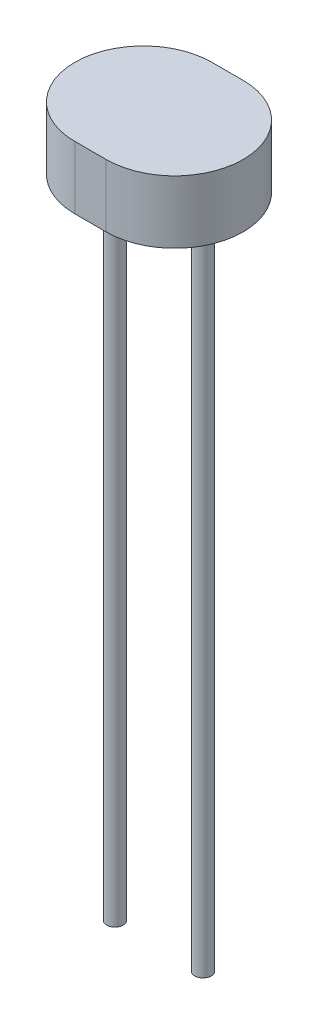
ISO-10303-21;
HEADER;
FILE_DESCRIPTION(('STEP AP214'),'2;1');
FILE_NAME('part.step','',(''),(''),'','','');
FILE_SCHEMA(('AUTOMOTIVE_DESIGN { 1 0 10303 214 1 1 1 1 }'));
ENDSEC;
DATA;
#1=APPLICATION_CONTEXT('core data for automotive mechanical design processes');
#2=APPLICATION_PROTOCOL_DEFINITION('international standard','automotive_design',2000,#1);
#3=PRODUCT_CONTEXT('',#1,'mechanical');
#4=PRODUCT('Part','Part','',(#3));
#5=PRODUCT_RELATED_PRODUCT_CATEGORY('part','',(#4));
#6=PRODUCT_DEFINITION_FORMATION('','',#4);
#7=PRODUCT_DEFINITION_CONTEXT('part definition',#1,'design');
#8=PRODUCT_DEFINITION('design','',#6,#7);
#9=PRODUCT_DEFINITION_SHAPE('','',#8);
#10=(LENGTH_UNIT() NAMED_UNIT(*) SI_UNIT(.MILLI.,.METRE.));
#11=(NAMED_UNIT(*) PLANE_ANGLE_UNIT() SI_UNIT($,.RADIAN.));
#12=(NAMED_UNIT(*) SI_UNIT($,.STERADIAN.) SOLID_ANGLE_UNIT());
#13=UNCERTAINTY_MEASURE_WITH_UNIT(LENGTH_MEASURE(1.E-05),#10,'distance_accuracy_value','');
#14=(GEOMETRIC_REPRESENTATION_CONTEXT(3) GLOBAL_UNCERTAINTY_ASSIGNED_CONTEXT((#13)) GLOBAL_UNIT_ASSIGNED_CONTEXT((#10,
#11,#12)) REPRESENTATION_CONTEXT('',''));
#15=CARTESIAN_POINT('',(0.,0.,0.));
#16=DIRECTION('',(0.,0.,1.));
#17=DIRECTION('',(1.,0.,0.));
#18=AXIS2_PLACEMENT_3D('',#15,#16,#17);
#19=CARTESIAN_POINT('',(-0.475,1.9,0.));
#20=DIRECTION('',(0.,-1.,0.));
#21=DIRECTION('',(0.,0.,-1.));
#22=AXIS2_PLACEMENT_3D('',#19,#20,#21);
#23=CYLINDRICAL_SURFACE('',#22,2.075);
#24=CARTESIAN_POINT('',(-0.475,0.,0.));
#25=DIRECTION('',(0.,1.,0.));
#26=DIRECTION('',(0.,0.,1.));
#27=AXIS2_PLACEMENT_3D('',#24,#25,#26);
#28=CIRCLE('',#27,2.075);
#29=CARTESIAN_POINT('',(-0.475,0.,-2.075));
#30=VERTEX_POINT('',#29);
#31=CARTESIAN_POINT('',(-0.475,0.,2.075));
#32=VERTEX_POINT('',#31);
#33=EDGE_CURVE('E100',#30,#32,#28,.T.);
#34=ORIENTED_EDGE('',*,*,#33,.T.);
#35=DIRECTION('',(0.,-1.,0.));
#36=VECTOR('',#35,1.);
#37=CARTESIAN_POINT('',(-0.475,1.9,2.075));
#38=LINE('',#37,#36);
#39=CARTESIAN_POINT('',(-0.475,1.9,2.075));
#40=VERTEX_POINT('',#39);
#41=EDGE_CURVE('E91',#40,#32,#38,.T.);
#42=ORIENTED_EDGE('',*,*,#41,.F.);
#43=CARTESIAN_POINT('',(-0.475,1.9,0.));
#44=DIRECTION('',(0.,1.,0.));
#45=DIRECTION('',(0.,0.,1.));
#46=AXIS2_PLACEMENT_3D('',#43,#44,#45);
#47=CIRCLE('',#46,2.075);
#48=CARTESIAN_POINT('',(-0.475,1.9,-2.075));
#49=VERTEX_POINT('',#48);
#50=EDGE_CURVE('E85',#49,#40,#47,.T.);
#51=ORIENTED_EDGE('',*,*,#50,.F.);
#52=DIRECTION('',(0.,-1.,0.));
#53=VECTOR('',#52,1.);
#54=CARTESIAN_POINT('',(-0.475,1.9,-2.075));
#55=LINE('',#54,#53);
#56=EDGE_CURVE('E96',#49,#30,#55,.T.);
#57=ORIENTED_EDGE('',*,*,#56,.T.);
#58=EDGE_LOOP('',(#34,#42,#51,#57));
#59=FACE_BOUND('',#58,.T.);
#60=ADVANCED_FACE('F33',(#59),#23,.T.);
#61=CARTESIAN_POINT('',(-0.475,1.9,2.075));
#62=DIRECTION('',(0.,0.,-1.));
#63=DIRECTION('',(-1.,0.,0.));
#64=AXIS2_PLACEMENT_3D('',#61,#62,#63);
#65=PLANE('',#64);
#66=DIRECTION('',(1.,0.,0.));
#67=VECTOR('',#66,1.);
#68=CARTESIAN_POINT('',(-0.475,0.,2.075));
#69=LINE('',#68,#67);
#70=CARTESIAN_POINT('',(0.475000000000001,0.,2.075));
#71=VERTEX_POINT('',#70);
#72=EDGE_CURVE('E90',#32,#71,#69,.T.);
#73=ORIENTED_EDGE('',*,*,#72,.T.);
#74=DIRECTION('',(0.,-1.,0.));
#75=VECTOR('',#74,1.);
#76=CARTESIAN_POINT('',(0.475000000000001,1.9,2.075));
#77=LINE('',#76,#75);
#78=CARTESIAN_POINT('',(0.475000000000001,1.9,2.075));
#79=VERTEX_POINT('',#78);
#80=EDGE_CURVE('E88',#79,#71,#77,.T.);
#81=ORIENTED_EDGE('',*,*,#80,.F.);
#82=DIRECTION('',(1.,0.,0.));
#83=VECTOR('',#82,1.);
#84=CARTESIAN_POINT('',(-0.475,1.9,2.075));
#85=LINE('',#84,#83);
#86=EDGE_CURVE('E80',#40,#79,#85,.T.);
#87=ORIENTED_EDGE('',*,*,#86,.F.);
#88=ORIENTED_EDGE('',*,*,#41,.T.);
#89=EDGE_LOOP('',(#73,#81,#87,#88));
#90=FACE_BOUND('',#89,.T.);
#91=ADVANCED_FACE('F89',(#90),#65,.F.);
#92=CARTESIAN_POINT('',(0.475,1.9,0.));
#93=DIRECTION('',(0.,-1.,0.));
#94=DIRECTION('',(0.,0.,-1.));
#95=AXIS2_PLACEMENT_3D('',#92,#93,#94);
#96=CYLINDRICAL_SURFACE('',#95,2.075);
#97=CARTESIAN_POINT('',(0.475,0.,0.));
#98=DIRECTION('',(0.,1.,0.));
#99=DIRECTION('',(0.,0.,1.));
#100=AXIS2_PLACEMENT_3D('',#97,#98,#99);
#101=CIRCLE('',#100,2.075);
#102=CARTESIAN_POINT('',(0.474999999999999,0.,-2.075));
#103=VERTEX_POINT('',#102);
#104=EDGE_CURVE('E66',#71,#103,#101,.T.);
#105=ORIENTED_EDGE('',*,*,#104,.T.);
#106=DIRECTION('',(0.,-1.,0.));
#107=VECTOR('',#106,1.);
#108=CARTESIAN_POINT('',(0.474999999999999,1.9,-2.075));
#109=LINE('',#108,#107);
#110=CARTESIAN_POINT('',(0.474999999999999,1.9,-2.075));
#111=VERTEX_POINT('',#110);
#112=EDGE_CURVE('E92',#111,#103,#109,.T.);
#113=ORIENTED_EDGE('',*,*,#112,.F.);
#114=CARTESIAN_POINT('',(0.475,1.9,0.));
#115=DIRECTION('',(0.,1.,0.));
#116=DIRECTION('',(0.,0.,1.));
#117=AXIS2_PLACEMENT_3D('',#114,#115,#116);
#118=CIRCLE('',#117,2.075);
#119=EDGE_CURVE('E83',#79,#111,#118,.T.);
#120=ORIENTED_EDGE('',*,*,#119,.F.);
#121=ORIENTED_EDGE('',*,*,#80,.T.);
#122=EDGE_LOOP('',(#105,#113,#120,#121));
#123=FACE_BOUND('',#122,.T.);
#124=ADVANCED_FACE('F94',(#123),#96,.T.);
#125=CARTESIAN_POINT('',(-0.475,1.9,-2.075));
#126=DIRECTION('',(0.,0.,1.));
#127=DIRECTION('',(1.,0.,0.));
#128=AXIS2_PLACEMENT_3D('',#125,#126,#127);
#129=PLANE('',#128);
#130=DIRECTION('',(-1.,0.,0.));
#131=VECTOR('',#130,1.);
#132=CARTESIAN_POINT('',(-0.475,0.,-2.075));
#133=LINE('',#132,#131);
#134=EDGE_CURVE('E72',#103,#30,#133,.T.);
#135=ORIENTED_EDGE('',*,*,#134,.T.);
#136=ORIENTED_EDGE('',*,*,#56,.F.);
#137=DIRECTION('',(-1.,0.,0.));
#138=VECTOR('',#137,1.);
#139=CARTESIAN_POINT('',(-0.475,1.9,-2.075));
#140=LINE('',#139,#138);
#141=EDGE_CURVE('E49',#111,#49,#140,.T.);
#142=ORIENTED_EDGE('',*,*,#141,.F.);
#143=ORIENTED_EDGE('',*,*,#112,.T.);
#144=EDGE_LOOP('',(#135,#136,#142,#143));
#145=FACE_BOUND('',#144,.T.);
#146=ADVANCED_FACE('F121',(#145),#129,.F.);
#147=CARTESIAN_POINT('',(-0.475,1.9,0.));
#148=DIRECTION('',(0.,1.,0.));
#149=DIRECTION('',(0.,0.,1.));
#150=AXIS2_PLACEMENT_3D('',#147,#148,#149);
#151=PLANE('',#150);
#152=ORIENTED_EDGE('',*,*,#50,.T.);
#153=ORIENTED_EDGE('',*,*,#86,.T.);
#154=ORIENTED_EDGE('',*,*,#119,.T.);
#155=ORIENTED_EDGE('',*,*,#141,.T.);
#156=EDGE_LOOP('',(#152,#153,#154,#155));
#157=FACE_BOUND('',#156,.T.);
#158=ADVANCED_FACE('F81',(#157),#151,.T.);
#159=CARTESIAN_POINT('',(-0.475,0.,0.));
#160=DIRECTION('',(0.,1.,0.));
#161=DIRECTION('',(0.,0.,1.));
#162=AXIS2_PLACEMENT_3D('',#159,#160,#161);
#163=PLANE('',#162);
#164=CARTESIAN_POINT('',(1.33371264397152,0.,0.));
#165=DIRECTION('',(0.,1.,0.));
#166=DIRECTION('',(0.,0.,1.));
#167=AXIS2_PLACEMENT_3D('',#164,#165,#166);
#168=CIRCLE('',#167,0.25);
#169=CARTESIAN_POINT('',(1.33371264397152,0.,0.25));
#170=VERTEX_POINT('',#169);
#171=EDGE_CURVE('E11',#170,#170,#168,.F.);
#172=ORIENTED_EDGE('',*,*,#171,.F.);
#173=EDGE_LOOP('',(#172));
#174=FACE_BOUND('',#173,.T.);
#175=CARTESIAN_POINT('',(-1.33371264397152,0.,0.));
#176=DIRECTION('',(0.,1.,0.));
#177=DIRECTION('',(0.,0.,1.));
#178=AXIS2_PLACEMENT_3D('',#175,#176,#177);
#179=CIRCLE('',#178,0.25);
#180=CARTESIAN_POINT('',(-1.33371264397152,0.,0.25));
#181=VERTEX_POINT('',#180);
#182=EDGE_CURVE('E41',#181,#181,#179,.F.);
#183=ORIENTED_EDGE('',*,*,#182,.F.);
#184=EDGE_LOOP('',(#183));
#185=FACE_BOUND('',#184,.T.);
#186=ORIENTED_EDGE('',*,*,#33,.F.);
#187=ORIENTED_EDGE('',*,*,#134,.F.);
#188=ORIENTED_EDGE('',*,*,#104,.F.);
#189=ORIENTED_EDGE('',*,*,#72,.F.);
#190=EDGE_LOOP('',(#186,#187,#188,#189));
#191=FACE_BOUND('',#190,.T.);
#192=ADVANCED_FACE('F114',(#174,#185,#191),#163,.F.);
#193=CARTESIAN_POINT('',(-1.33371264397152,-20.,0.));
#194=DIRECTION('',(0.,1.,0.));
#195=DIRECTION('',(0.,0.,1.));
#196=AXIS2_PLACEMENT_3D('',#193,#194,#195);
#197=CYLINDRICAL_SURFACE('',#196,0.25);
#198=CARTESIAN_POINT('',(-1.33371264397152,-20.,0.));
#199=DIRECTION('',(0.,-1.,0.));
#200=DIRECTION('',(0.,0.,-1.));
#201=AXIS2_PLACEMENT_3D('',#198,#199,#200);
#202=CIRCLE('',#201,0.25);
#203=CARTESIAN_POINT('',(-1.33371264397152,-20.,-0.25));
#204=VERTEX_POINT('',#203);
#205=EDGE_CURVE('E103',#204,#204,#202,.T.);
#206=ORIENTED_EDGE('',*,*,#205,.F.);
#207=EDGE_LOOP('',(#206));
#208=FACE_BOUND('',#207,.T.);
#209=ORIENTED_EDGE('',*,*,#182,.T.);
#210=EDGE_LOOP('',(#209));
#211=FACE_BOUND('',#210,.T.);
#212=ADVANCED_FACE('F112',(#208,#211),#197,.T.);
#213=CARTESIAN_POINT('',(-1.33371264397152,-20.,0.));
#214=DIRECTION('',(0.,-1.,0.));
#215=DIRECTION('',(0.,0.,-1.));
#216=AXIS2_PLACEMENT_3D('',#213,#214,#215);
#217=PLANE('',#216);
#218=ORIENTED_EDGE('',*,*,#205,.T.);
#219=EDGE_LOOP('',(#218));
#220=FACE_BOUND('',#219,.T.);
#221=ADVANCED_FACE('F165',(#220),#217,.T.);
#222=CARTESIAN_POINT('',(1.33371264397152,-20.,0.));
#223=DIRECTION('',(0.,1.,0.));
#224=DIRECTION('',(0.,0.,1.));
#225=AXIS2_PLACEMENT_3D('',#222,#223,#224);
#226=CYLINDRICAL_SURFACE('',#225,0.25);
#227=CARTESIAN_POINT('',(1.33371264397152,-20.,0.));
#228=DIRECTION('',(0.,-1.,0.));
#229=DIRECTION('',(0.,0.,1.));
#230=AXIS2_PLACEMENT_3D('',#227,#228,#229);
#231=CIRCLE('',#230,0.25);
#232=CARTESIAN_POINT('',(1.33371264397152,-20.,0.25));
#233=VERTEX_POINT('',#232);
#234=EDGE_CURVE('E201',#233,#233,#231,.T.);
#235=ORIENTED_EDGE('',*,*,#234,.F.);
#236=EDGE_LOOP('',(#235));
#237=FACE_BOUND('',#236,.T.);
#238=ORIENTED_EDGE('',*,*,#171,.T.);
#239=EDGE_LOOP('',(#238));
#240=FACE_BOUND('',#239,.T.);
#241=ADVANCED_FACE('F175',(#237,#240),#226,.T.);
#242=CARTESIAN_POINT('',(1.33371264397152,-20.,0.));
#243=DIRECTION('',(0.,1.,0.));
#244=DIRECTION('',(0.,0.,1.));
#245=AXIS2_PLACEMENT_3D('',#242,#243,#244);
#246=PLANE('',#245);
#247=ORIENTED_EDGE('',*,*,#234,.T.);
#248=EDGE_LOOP('',(#247));
#249=FACE_BOUND('',#248,.T.);
#250=ADVANCED_FACE('F185',(#249),#246,.F.);
#251=CLOSED_SHELL('',(#60,#91,#124,#146,#158,#192,#212,#221,#241,#250));
#252=MANIFOLD_SOLID_BREP('B2',#251);
#253=ADVANCED_BREP_SHAPE_REPRESENTATION('',(#18,#252),#14);
#254=SHAPE_DEFINITION_REPRESENTATION(#9,#253);
ENDSEC;
END-ISO-10303-21;
